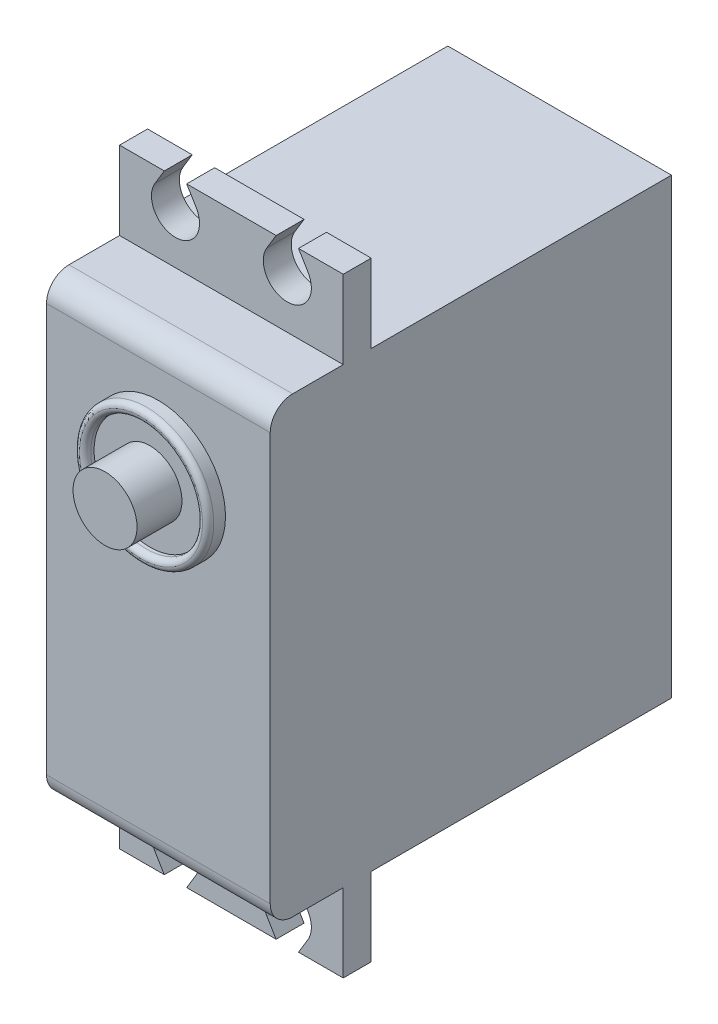
ISO-10303-21;
HEADER;
FILE_DESCRIPTION(('STEP AP214'),'2;1');
FILE_NAME('part.step','',(''),(''),'','','');
FILE_SCHEMA(('AUTOMOTIVE_DESIGN { 1 0 10303 214 1 1 1 1 }'));
ENDSEC;
DATA;
#1=APPLICATION_CONTEXT('core data for automotive mechanical design processes');
#2=APPLICATION_PROTOCOL_DEFINITION('international standard','automotive_design',2000,#1);
#3=PRODUCT_CONTEXT('',#1,'mechanical');
#4=PRODUCT('Part','Part','',(#3));
#5=PRODUCT_RELATED_PRODUCT_CATEGORY('part','',(#4));
#6=PRODUCT_DEFINITION_FORMATION('','',#4);
#7=PRODUCT_DEFINITION_CONTEXT('part definition',#1,'design');
#8=PRODUCT_DEFINITION('design','',#6,#7);
#9=PRODUCT_DEFINITION_SHAPE('','',#8);
#10=(LENGTH_UNIT() NAMED_UNIT(*) SI_UNIT(.MILLI.,.METRE.));
#11=(NAMED_UNIT(*) PLANE_ANGLE_UNIT() SI_UNIT($,.RADIAN.));
#12=(NAMED_UNIT(*) SI_UNIT($,.STERADIAN.) SOLID_ANGLE_UNIT());
#13=UNCERTAINTY_MEASURE_WITH_UNIT(LENGTH_MEASURE(1.E-05),#10,'distance_accuracy_value','');
#14=(GEOMETRIC_REPRESENTATION_CONTEXT(3) GLOBAL_UNCERTAINTY_ASSIGNED_CONTEXT((#13)) GLOBAL_UNIT_ASSIGNED_CONTEXT((#10,
#11,#12)) REPRESENTATION_CONTEXT('',''));
#15=CARTESIAN_POINT('',(0.,0.,0.));
#16=DIRECTION('',(0.,0.,1.));
#17=DIRECTION('',(1.,0.,0.));
#18=AXIS2_PLACEMENT_3D('',#15,#16,#17);
#19=CARTESIAN_POINT('',(10.,-27.25,-6.52999999999999));
#20=DIRECTION('',(0.,0.,-1.));
#21=DIRECTION('',(0.,1.,0.));
#22=AXIS2_PLACEMENT_3D('',#19,#20,#21);
#23=PLANE('',#22);
#24=DIRECTION('',(-0.517799102380035,-0.855502244049909,0.));
#25=VECTOR('',#24,1.);
#26=CARTESIAN_POINT('',(9.14362215465058,-5.53424538288419,-6.53000000000004));
#27=LINE('',#26,#25);
#28=CARTESIAN_POINT('',(-3.1606701752927,-25.8632680701171,-6.53000000000004));
#29=VERTEX_POINT('',#28);
#30=CARTESIAN_POINT('',(-4.,-27.25,-6.53000000000004));
#31=VERTEX_POINT('',#30);
#32=EDGE_CURVE('E242',#29,#31,#27,.T.);
#33=ORIENTED_EDGE('',*,*,#32,.T.);
#34=DIRECTION('',(-1.,0.,0.));
#35=VECTOR('',#34,1.);
#36=CARTESIAN_POINT('',(10.,-27.25,-6.52999999999999));
#37=LINE('',#36,#35);
#38=CARTESIAN_POINT('',(4.,-27.25,-6.53000000000004));
#39=VERTEX_POINT('',#38);
#40=EDGE_CURVE('E425',#39,#31,#37,.T.);
#41=ORIENTED_EDGE('',*,*,#40,.F.);
#42=DIRECTION('',(0.517799102380035,-0.855502244049909,0.));
#43=VECTOR('',#42,1.);
#44=CARTESIAN_POINT('',(-9.14362215465058,-5.53424538288419,-6.53000000000004));
#45=LINE('',#44,#43);
#46=CARTESIAN_POINT('',(3.1606701752927,-25.8632680701171,-6.53000000000004));
#47=VERTEX_POINT('',#46);
#48=EDGE_CURVE('E278',#47,#39,#45,.T.);
#49=ORIENTED_EDGE('',*,*,#48,.F.);
#50=CARTESIAN_POINT('',(5.,-24.75,-6.53000000000004));
#51=DIRECTION('',(0.,0.,-1.));
#52=DIRECTION('',(1.,0.,0.));
#53=AXIS2_PLACEMENT_3D('',#50,#51,#52);
#54=CIRCLE('',#53,2.15);
#55=CARTESIAN_POINT('',(6.83932982470731,-25.8632680701171,-6.53000000000004));
#56=VERTEX_POINT('',#55);
#57=EDGE_CURVE('E275',#56,#47,#54,.F.);
#58=ORIENTED_EDGE('',*,*,#57,.F.);
#59=DIRECTION('',(-0.517799102380035,-0.855502244049909,0.));
#60=VECTOR('',#59,1.);
#61=CARTESIAN_POINT('',(16.4624630503949,-9.96402832341568,-6.53000000000004));
#62=LINE('',#61,#60);
#63=CARTESIAN_POINT('',(6.,-27.25,-6.53000000000004));
#64=VERTEX_POINT('',#63);
#65=EDGE_CURVE('E280',#56,#64,#62,.T.);
#66=ORIENTED_EDGE('',*,*,#65,.T.);
#67=CARTESIAN_POINT('',(10.,-27.25,-6.52999999999999));
#68=VERTEX_POINT('',#67);
#69=EDGE_CURVE('E421',#68,#64,#37,.T.);
#70=ORIENTED_EDGE('',*,*,#69,.F.);
#71=DIRECTION('',(0.,-1.,0.));
#72=VECTOR('',#71,1.);
#73=CARTESIAN_POINT('',(10.,-27.25,-6.52999999999999));
#74=LINE('',#73,#72);
#75=CARTESIAN_POINT('',(10.,-20.25,-6.53000000000001));
#76=VERTEX_POINT('',#75);
#77=EDGE_CURVE('E367',#76,#68,#74,.T.);
#78=ORIENTED_EDGE('',*,*,#77,.F.);
#79=DIRECTION('',(-1.,0.,0.));
#80=VECTOR('',#79,1.);
#81=CARTESIAN_POINT('',(10.,-20.25,-6.53000000000001));
#82=LINE('',#81,#80);
#83=CARTESIAN_POINT('',(-10.,-20.25,-6.53000000000001));
#84=VERTEX_POINT('',#83);
#85=EDGE_CURVE('E424',#76,#84,#82,.T.);
#86=ORIENTED_EDGE('',*,*,#85,.T.);
#87=DIRECTION('',(0.,-1.,0.));
#88=VECTOR('',#87,1.);
#89=CARTESIAN_POINT('',(-10.,-27.25,-6.52999999999999));
#90=LINE('',#89,#88);
#91=CARTESIAN_POINT('',(-10.,-27.25,-6.52999999999999));
#92=VERTEX_POINT('',#91);
#93=EDGE_CURVE('E398',#84,#92,#90,.T.);
#94=ORIENTED_EDGE('',*,*,#93,.T.);
#95=CARTESIAN_POINT('',(-6.,-27.25,-6.53000000000004));
#96=VERTEX_POINT('',#95);
#97=EDGE_CURVE('E256',#96,#92,#37,.T.);
#98=ORIENTED_EDGE('',*,*,#97,.F.);
#99=DIRECTION('',(0.517799102380035,-0.855502244049909,0.));
#100=VECTOR('',#99,1.);
#101=CARTESIAN_POINT('',(-16.4624630503949,-9.96402832341568,-6.53000000000004));
#102=LINE('',#101,#100);
#103=CARTESIAN_POINT('',(-6.83932982470731,-25.8632680701171,-6.53000000000004));
#104=VERTEX_POINT('',#103);
#105=EDGE_CURVE('E238',#104,#96,#102,.T.);
#106=ORIENTED_EDGE('',*,*,#105,.F.);
#107=CARTESIAN_POINT('',(-5.,-24.75,-6.53000000000004));
#108=DIRECTION('',(0.,0.,-1.));
#109=DIRECTION('',(1.,0.,0.));
#110=AXIS2_PLACEMENT_3D('',#107,#108,#109);
#111=CIRCLE('',#110,2.15);
#112=EDGE_CURVE('E245',#104,#29,#111,.T.);
#113=ORIENTED_EDGE('',*,*,#112,.T.);
#114=EDGE_LOOP('',(#33,#41,#49,#58,#66,#70,#78,#86,#94,#98,#106,#113));
#115=FACE_BOUND('',#114,.T.);
#116=ADVANCED_FACE('F38',(#115),#23,.F.);
#117=CARTESIAN_POINT('',(10.,-27.25,-9.02999999999999));
#118=DIRECTION('',(0.,1.,0.));
#119=DIRECTION('',(0.,0.,1.));
#120=AXIS2_PLACEMENT_3D('',#117,#118,#119);
#121=PLANE('',#120);
#122=DIRECTION('',(0.,0.,1.));
#123=VECTOR('',#122,1.);
#124=CARTESIAN_POINT('',(-4.,-27.25,-15.363442981507));
#125=LINE('',#124,#123);
#126=CARTESIAN_POINT('',(-4.,-27.25,-9.02999999999999));
#127=VERTEX_POINT('',#126);
#128=EDGE_CURVE('E263',#127,#31,#125,.T.);
#129=ORIENTED_EDGE('',*,*,#128,.F.);
#130=DIRECTION('',(-1.,0.,0.));
#131=VECTOR('',#130,1.);
#132=CARTESIAN_POINT('',(10.,-27.25,-9.02999999999999));
#133=LINE('',#132,#131);
#134=CARTESIAN_POINT('',(3.99999999999999,-27.25,-9.02999999999999));
#135=VERTEX_POINT('',#134);
#136=EDGE_CURVE('E420',#135,#127,#133,.T.);
#137=ORIENTED_EDGE('',*,*,#136,.F.);
#138=DIRECTION('',(0.,0.,1.));
#139=VECTOR('',#138,1.);
#140=CARTESIAN_POINT('',(4.,-27.25,-15.363442981507));
#141=LINE('',#140,#139);
#142=EDGE_CURVE('E62',#135,#39,#141,.T.);
#143=ORIENTED_EDGE('',*,*,#142,.T.);
#144=ORIENTED_EDGE('',*,*,#40,.T.);
#145=EDGE_LOOP('',(#129,#137,#143,#144));
#146=FACE_BOUND('',#145,.T.);
#147=ADVANCED_FACE('F477',(#146),#121,.F.);
#148=DIRECTION('',(0.,0.,1.));
#149=VECTOR('',#148,1.);
#150=CARTESIAN_POINT('',(6.,-27.25,-15.363442981507));
#151=LINE('',#150,#149);
#152=CARTESIAN_POINT('',(6.,-27.25,-9.02999999999999));
#153=VERTEX_POINT('',#152);
#154=EDGE_CURVE('E285',#153,#64,#151,.T.);
#155=ORIENTED_EDGE('',*,*,#154,.F.);
#156=CARTESIAN_POINT('',(10.,-27.25,-9.02999999999999));
#157=VERTEX_POINT('',#156);
#158=EDGE_CURVE('E417',#157,#153,#133,.T.);
#159=ORIENTED_EDGE('',*,*,#158,.F.);
#160=DIRECTION('',(0.,0.,-1.));
#161=VECTOR('',#160,1.);
#162=CARTESIAN_POINT('',(10.,-27.25,-9.02999999999999));
#163=LINE('',#162,#161);
#164=EDGE_CURVE('E369',#68,#157,#163,.T.);
#165=ORIENTED_EDGE('',*,*,#164,.F.);
#166=ORIENTED_EDGE('',*,*,#69,.T.);
#167=EDGE_LOOP('',(#155,#159,#165,#166));
#168=FACE_BOUND('',#167,.T.);
#169=ADVANCED_FACE('F482',(#168),#121,.F.);
#170=CARTESIAN_POINT('',(10.,-20.25,-9.02999999999999));
#171=DIRECTION('',(0.,0.,1.));
#172=DIRECTION('',(0.,-1.,0.));
#173=AXIS2_PLACEMENT_3D('',#170,#171,#172);
#174=PLANE('',#173);
#175=DIRECTION('',(0.517799102380035,0.855502244049909,0.));
#176=VECTOR('',#175,1.);
#177=CARTESIAN_POINT('',(9.14362215465058,-5.53424538288419,-9.02999999999999));
#178=LINE('',#177,#176);
#179=CARTESIAN_POINT('',(-3.1606701752927,-25.8632680701171,-9.02999999999999));
#180=VERTEX_POINT('',#179);
#181=EDGE_CURVE('E262',#127,#180,#178,.T.);
#182=ORIENTED_EDGE('',*,*,#181,.T.);
#183=CARTESIAN_POINT('',(-5.,-24.75,-9.02999999999999));
#184=DIRECTION('',(0.,0.,1.));
#185=DIRECTION('',(1.,0.,0.));
#186=AXIS2_PLACEMENT_3D('',#183,#184,#185);
#187=CIRCLE('',#186,2.15);
#188=CARTESIAN_POINT('',(-6.83932982470731,-25.8632680701171,-9.02999999999999));
#189=VERTEX_POINT('',#188);
#190=EDGE_CURVE('E268',#180,#189,#187,.T.);
#191=ORIENTED_EDGE('',*,*,#190,.T.);
#192=DIRECTION('',(-0.517799102380035,0.855502244049909,0.));
#193=VECTOR('',#192,1.);
#194=CARTESIAN_POINT('',(-16.4624630503949,-9.96402832341568,-9.02999999999999));
#195=LINE('',#194,#193);
#196=CARTESIAN_POINT('',(-6.,-27.25,-9.02999999999999));
#197=VERTEX_POINT('',#196);
#198=EDGE_CURVE('E239',#197,#189,#195,.T.);
#199=ORIENTED_EDGE('',*,*,#198,.F.);
#200=CARTESIAN_POINT('',(-10.,-27.25,-9.02999999999999));
#201=VERTEX_POINT('',#200);
#202=EDGE_CURVE('E416',#197,#201,#133,.T.);
#203=ORIENTED_EDGE('',*,*,#202,.T.);
#204=DIRECTION('',(0.,1.,0.));
#205=VECTOR('',#204,1.);
#206=CARTESIAN_POINT('',(-10.,-20.25,-9.02999999999999));
#207=LINE('',#206,#205);
#208=CARTESIAN_POINT('',(-10.,-20.25,-9.02999999999999));
#209=VERTEX_POINT('',#208);
#210=EDGE_CURVE('E403',#201,#209,#207,.T.);
#211=ORIENTED_EDGE('',*,*,#210,.T.);
#212=DIRECTION('',(-1.,0.,0.));
#213=VECTOR('',#212,1.);
#214=CARTESIAN_POINT('',(10.,-20.25,-9.02999999999999));
#215=LINE('',#214,#213);
#216=CARTESIAN_POINT('',(10.,-20.25,-9.02999999999999));
#217=VERTEX_POINT('',#216);
#218=EDGE_CURVE('E413',#217,#209,#215,.T.);
#219=ORIENTED_EDGE('',*,*,#218,.F.);
#220=DIRECTION('',(0.,1.,0.));
#221=VECTOR('',#220,1.);
#222=CARTESIAN_POINT('',(10.,-20.25,-9.02999999999999));
#223=LINE('',#222,#221);
#224=EDGE_CURVE('E371',#157,#217,#223,.T.);
#225=ORIENTED_EDGE('',*,*,#224,.F.);
#226=ORIENTED_EDGE('',*,*,#158,.T.);
#227=DIRECTION('',(0.517799102380035,0.855502244049909,0.));
#228=VECTOR('',#227,1.);
#229=CARTESIAN_POINT('',(16.4624630503949,-9.96402832341568,-9.02999999999999));
#230=LINE('',#229,#228);
#231=CARTESIAN_POINT('',(6.83932982470731,-25.8632680701171,-9.02999999999999));
#232=VERTEX_POINT('',#231);
#233=EDGE_CURVE('E269',#153,#232,#230,.T.);
#234=ORIENTED_EDGE('',*,*,#233,.T.);
#235=CARTESIAN_POINT('',(5.,-24.75,-9.02999999999999));
#236=DIRECTION('',(0.,0.,1.));
#237=DIRECTION('',(1.,0.,0.));
#238=AXIS2_PLACEMENT_3D('',#235,#236,#237);
#239=CIRCLE('',#238,2.15);
#240=CARTESIAN_POINT('',(3.1606701752927,-25.8632680701171,-9.02999999999999));
#241=VERTEX_POINT('',#240);
#242=EDGE_CURVE('E272',#241,#232,#239,.F.);
#243=ORIENTED_EDGE('',*,*,#242,.F.);
#244=DIRECTION('',(-0.517799102380035,0.855502244049909,0.));
#245=VECTOR('',#244,1.);
#246=CARTESIAN_POINT('',(-9.14362215465058,-5.53424538288419,-9.02999999999999));
#247=LINE('',#246,#245);
#248=EDGE_CURVE('E252',#135,#241,#247,.T.);
#249=ORIENTED_EDGE('',*,*,#248,.F.);
#250=ORIENTED_EDGE('',*,*,#136,.T.);
#251=EDGE_LOOP('',(#182,#191,#199,#203,#211,#219,#225,#226,#234,#243,#249,#250));
#252=FACE_BOUND('',#251,.T.);
#253=ADVANCED_FACE('F521',(#252),#174,.F.);
#254=CARTESIAN_POINT('',(10.,20.25,-9.02999999999999));
#255=DIRECTION('',(0.,0.,1.));
#256=DIRECTION('',(1.,0.,0.));
#257=AXIS2_PLACEMENT_3D('',#254,#255,#256);
#258=PLANE('',#257);
#259=DIRECTION('',(-0.517799102380035,-0.855502244049909,0.));
#260=VECTOR('',#259,1.);
#261=CARTESIAN_POINT('',(-16.4624630503949,9.96402832341568,-9.02999999999999));
#262=LINE('',#261,#260);
#263=CARTESIAN_POINT('',(-6.,27.25,-9.02999999999999));
#264=VERTEX_POINT('',#263);
#265=CARTESIAN_POINT('',(-6.83932982470731,25.8632680701171,-9.02999999999999));
#266=VERTEX_POINT('',#265);
#267=EDGE_CURVE('E297',#264,#266,#262,.T.);
#268=ORIENTED_EDGE('',*,*,#267,.T.);
#269=CARTESIAN_POINT('',(-5.,24.75,-9.02999999999999));
#270=DIRECTION('',(0.,0.,1.));
#271=DIRECTION('',(1.,0.,0.));
#272=AXIS2_PLACEMENT_3D('',#269,#270,#271);
#273=CIRCLE('',#272,2.15);
#274=CARTESIAN_POINT('',(-3.1606701752927,25.8632680701171,-9.02999999999999));
#275=VERTEX_POINT('',#274);
#276=EDGE_CURVE('E300',#275,#266,#273,.F.);
#277=ORIENTED_EDGE('',*,*,#276,.F.);
#278=DIRECTION('',(0.517799102380035,-0.855502244049909,0.));
#279=VECTOR('',#278,1.);
#280=CARTESIAN_POINT('',(9.14362215465058,5.53424538288419,-9.02999999999999));
#281=LINE('',#280,#279);
#282=CARTESIAN_POINT('',(-4.,27.25,-9.02999999999999));
#283=VERTEX_POINT('',#282);
#284=EDGE_CURVE('E303',#283,#275,#281,.T.);
#285=ORIENTED_EDGE('',*,*,#284,.F.);
#286=DIRECTION('',(-1.,0.,0.));
#287=VECTOR('',#286,1.);
#288=CARTESIAN_POINT('',(10.,27.25,-9.02999999999999));
#289=LINE('',#288,#287);
#290=CARTESIAN_POINT('',(4.,27.25,-9.02999999999999));
#291=VERTEX_POINT('',#290);
#292=EDGE_CURVE('E453',#291,#283,#289,.T.);
#293=ORIENTED_EDGE('',*,*,#292,.F.);
#294=DIRECTION('',(-0.517799102380035,-0.855502244049909,0.));
#295=VECTOR('',#294,1.);
#296=CARTESIAN_POINT('',(-9.14362215465058,5.53424538288419,-9.02999999999999));
#297=LINE('',#296,#295);
#298=CARTESIAN_POINT('',(3.1606701752927,25.8632680701171,-9.02999999999999));
#299=VERTEX_POINT('',#298);
#300=EDGE_CURVE('E323',#291,#299,#297,.T.);
#301=ORIENTED_EDGE('',*,*,#300,.T.);
#302=CARTESIAN_POINT('',(5.,24.75,-9.02999999999999));
#303=DIRECTION('',(0.,0.,1.));
#304=DIRECTION('',(1.,0.,0.));
#305=AXIS2_PLACEMENT_3D('',#302,#303,#304);
#306=CIRCLE('',#305,2.15);
#307=CARTESIAN_POINT('',(6.83932982470731,25.8632680701171,-9.02999999999999));
#308=VERTEX_POINT('',#307);
#309=EDGE_CURVE('E326',#299,#308,#306,.T.);
#310=ORIENTED_EDGE('',*,*,#309,.T.);
#311=DIRECTION('',(0.517799102380035,-0.855502244049909,0.));
#312=VECTOR('',#311,1.);
#313=CARTESIAN_POINT('',(16.4624630503949,9.96402832341568,-9.02999999999999));
#314=LINE('',#313,#312);
#315=CARTESIAN_POINT('',(6.,27.25,-9.02999999999999));
#316=VERTEX_POINT('',#315);
#317=EDGE_CURVE('E307',#316,#308,#314,.T.);
#318=ORIENTED_EDGE('',*,*,#317,.F.);
#319=CARTESIAN_POINT('',(10.,27.25,-9.02999999999999));
#320=VERTEX_POINT('',#319);
#321=EDGE_CURVE('E449',#320,#316,#289,.T.);
#322=ORIENTED_EDGE('',*,*,#321,.F.);
#323=DIRECTION('',(0.,1.,0.));
#324=VECTOR('',#323,1.);
#325=CARTESIAN_POINT('',(10.,20.25,-9.02999999999999));
#326=LINE('',#325,#324);
#327=CARTESIAN_POINT('',(10.,20.25,-9.02999999999999));
#328=VERTEX_POINT('',#327);
#329=EDGE_CURVE('E350',#328,#320,#326,.T.);
#330=ORIENTED_EDGE('',*,*,#329,.F.);
#331=DIRECTION('',(-1.,0.,0.));
#332=VECTOR('',#331,1.);
#333=CARTESIAN_POINT('',(10.,20.25,-9.02999999999999));
#334=LINE('',#333,#332);
#335=CARTESIAN_POINT('',(-10.,20.25,-9.02999999999999));
#336=VERTEX_POINT('',#335);
#337=EDGE_CURVE('E452',#328,#336,#334,.T.);
#338=ORIENTED_EDGE('',*,*,#337,.T.);
#339=DIRECTION('',(0.,1.,0.));
#340=VECTOR('',#339,1.);
#341=CARTESIAN_POINT('',(-10.,20.25,-9.02999999999999));
#342=LINE('',#341,#340);
#343=CARTESIAN_POINT('',(-10.,27.25,-9.02999999999999));
#344=VERTEX_POINT('',#343);
#345=EDGE_CURVE('E380',#336,#344,#342,.T.);
#346=ORIENTED_EDGE('',*,*,#345,.T.);
#347=EDGE_CURVE('E447',#264,#344,#289,.T.);
#348=ORIENTED_EDGE('',*,*,#347,.F.);
#349=EDGE_LOOP('',(#268,#277,#285,#293,#301,#310,#318,#322,#330,#338,#346,#348));
#350=FACE_BOUND('',#349,.T.);
#351=ADVANCED_FACE('F519',(#350),#258,.F.);
#352=CARTESIAN_POINT('',(10.,27.25,-9.02999999999999));
#353=DIRECTION('',(0.,-1.,0.));
#354=DIRECTION('',(0.,0.,-1.));
#355=AXIS2_PLACEMENT_3D('',#352,#353,#354);
#356=PLANE('',#355);
#357=DIRECTION('',(0.,0.,1.));
#358=VECTOR('',#357,1.);
#359=CARTESIAN_POINT('',(-6.,27.25,-15.363442981507));
#360=LINE('',#359,#358);
#361=CARTESIAN_POINT('',(-6.,27.25,-6.53000000000004));
#362=VERTEX_POINT('',#361);
#363=EDGE_CURVE('E314',#264,#362,#360,.T.);
#364=ORIENTED_EDGE('',*,*,#363,.F.);
#365=ORIENTED_EDGE('',*,*,#347,.T.);
#366=DIRECTION('',(0.,0.,1.));
#367=VECTOR('',#366,1.);
#368=CARTESIAN_POINT('',(-10.,27.25,-9.02999999999999));
#369=LINE('',#368,#367);
#370=CARTESIAN_POINT('',(-10.,27.25,-6.52999999999999));
#371=VERTEX_POINT('',#370);
#372=EDGE_CURVE('E383',#344,#371,#369,.T.);
#373=ORIENTED_EDGE('',*,*,#372,.T.);
#374=DIRECTION('',(-1.,0.,0.));
#375=VECTOR('',#374,1.);
#376=CARTESIAN_POINT('',(10.,27.25,-6.52999999999999));
#377=LINE('',#376,#375);
#378=EDGE_CURVE('E443',#362,#371,#377,.T.);
#379=ORIENTED_EDGE('',*,*,#378,.F.);
#380=EDGE_LOOP('',(#364,#365,#373,#379));
#381=FACE_BOUND('',#380,.T.);
#382=ADVANCED_FACE('F518',(#381),#356,.F.);
#383=ORIENTED_EDGE('',*,*,#292,.T.);
#384=DIRECTION('',(0.,0.,1.));
#385=VECTOR('',#384,1.);
#386=CARTESIAN_POINT('',(-4.,27.25,-15.363442981507));
#387=LINE('',#386,#385);
#388=CARTESIAN_POINT('',(-4.,27.25,-6.53000000000004));
#389=VERTEX_POINT('',#388);
#390=EDGE_CURVE('E316',#283,#389,#387,.T.);
#391=ORIENTED_EDGE('',*,*,#390,.T.);
#392=CARTESIAN_POINT('',(4.,27.25,-6.53000000000004));
#393=VERTEX_POINT('',#392);
#394=EDGE_CURVE('E448',#393,#389,#377,.T.);
#395=ORIENTED_EDGE('',*,*,#394,.F.);
#396=DIRECTION('',(0.,0.,1.));
#397=VECTOR('',#396,1.);
#398=CARTESIAN_POINT('',(4.,27.25,-15.363442981507));
#399=LINE('',#398,#397);
#400=EDGE_CURVE('E339',#291,#393,#399,.T.);
#401=ORIENTED_EDGE('',*,*,#400,.F.);
#402=EDGE_LOOP('',(#383,#391,#395,#401));
#403=FACE_BOUND('',#402,.T.);
#404=ADVANCED_FACE('F513',(#403),#356,.F.);
#405=CARTESIAN_POINT('',(10.,27.25,-6.52999999999999));
#406=DIRECTION('',(0.,0.,-1.));
#407=DIRECTION('',(0.,1.,0.));
#408=AXIS2_PLACEMENT_3D('',#405,#406,#407);
#409=PLANE('',#408);
#410=DIRECTION('',(0.517799102380035,0.855502244049909,0.));
#411=VECTOR('',#410,1.);
#412=CARTESIAN_POINT('',(-16.4624630503949,9.96402832341568,-6.53000000000004));
#413=LINE('',#412,#411);
#414=CARTESIAN_POINT('',(-6.83932982470731,25.8632680701171,-6.53000000000004));
#415=VERTEX_POINT('',#414);
#416=EDGE_CURVE('E309',#415,#362,#413,.T.);
#417=ORIENTED_EDGE('',*,*,#416,.T.);
#418=ORIENTED_EDGE('',*,*,#378,.T.);
#419=DIRECTION('',(0.,-1.,0.));
#420=VECTOR('',#419,1.);
#421=CARTESIAN_POINT('',(-10.,27.25,-6.52999999999999));
#422=LINE('',#421,#420);
#423=CARTESIAN_POINT('',(-10.,20.25,-6.53));
#424=VERTEX_POINT('',#423);
#425=EDGE_CURVE('E386',#371,#424,#422,.T.);
#426=ORIENTED_EDGE('',*,*,#425,.T.);
#427=DIRECTION('',(-1.,0.,0.));
#428=VECTOR('',#427,1.);
#429=CARTESIAN_POINT('',(10.,20.25,-6.53));
#430=LINE('',#429,#428);
#431=CARTESIAN_POINT('',(10.,20.25,-6.53));
#432=VERTEX_POINT('',#431);
#433=EDGE_CURVE('E440',#432,#424,#430,.T.);
#434=ORIENTED_EDGE('',*,*,#433,.F.);
#435=DIRECTION('',(0.,-1.,0.));
#436=VECTOR('',#435,1.);
#437=CARTESIAN_POINT('',(10.,27.25,-6.52999999999999));
#438=LINE('',#437,#436);
#439=CARTESIAN_POINT('',(10.,27.25,-6.52999999999999));
#440=VERTEX_POINT('',#439);
#441=EDGE_CURVE('E355',#440,#432,#438,.T.);
#442=ORIENTED_EDGE('',*,*,#441,.F.);
#443=CARTESIAN_POINT('',(6.,27.25,-6.53000000000004));
#444=VERTEX_POINT('',#443);
#445=EDGE_CURVE('E444',#440,#444,#377,.T.);
#446=ORIENTED_EDGE('',*,*,#445,.T.);
#447=DIRECTION('',(-0.517799102380035,0.855502244049909,0.));
#448=VECTOR('',#447,1.);
#449=CARTESIAN_POINT('',(16.4624630503949,9.96402832341568,-6.53000000000004));
#450=LINE('',#449,#448);
#451=CARTESIAN_POINT('',(6.83932982470731,25.8632680701171,-6.52999999999999));
#452=VERTEX_POINT('',#451);
#453=EDGE_CURVE('E332',#452,#444,#450,.T.);
#454=ORIENTED_EDGE('',*,*,#453,.F.);
#455=CARTESIAN_POINT('',(5.,24.75,-6.53000000000004));
#456=DIRECTION('',(0.,0.,1.));
#457=DIRECTION('',(1.,0.,0.));
#458=AXIS2_PLACEMENT_3D('',#455,#456,#457);
#459=CIRCLE('',#458,2.15);
#460=CARTESIAN_POINT('',(3.1606701752927,25.8632680701171,-6.53000000000004));
#461=VERTEX_POINT('',#460);
#462=EDGE_CURVE('E296',#452,#461,#459,.F.);
#463=ORIENTED_EDGE('',*,*,#462,.T.);
#464=DIRECTION('',(0.517799102380035,0.855502244049909,0.));
#465=VECTOR('',#464,1.);
#466=CARTESIAN_POINT('',(-9.14362215465058,5.53424538288419,-6.53000000000004));
#467=LINE('',#466,#465);
#468=EDGE_CURVE('E334',#461,#393,#467,.T.);
#469=ORIENTED_EDGE('',*,*,#468,.T.);
#470=ORIENTED_EDGE('',*,*,#394,.T.);
#471=DIRECTION('',(-0.517799102380035,0.855502244049909,0.));
#472=VECTOR('',#471,1.);
#473=CARTESIAN_POINT('',(9.14362215465058,5.53424538288419,-6.53000000000004));
#474=LINE('',#473,#472);
#475=CARTESIAN_POINT('',(-3.16067017529269,25.8632680701171,-6.52999999999999));
#476=VERTEX_POINT('',#475);
#477=EDGE_CURVE('E306',#476,#389,#474,.T.);
#478=ORIENTED_EDGE('',*,*,#477,.F.);
#479=CARTESIAN_POINT('',(-5.,24.75,-6.53000000000004));
#480=DIRECTION('',(0.,0.,1.));
#481=DIRECTION('',(1.,0.,0.));
#482=AXIS2_PLACEMENT_3D('',#479,#480,#481);
#483=CIRCLE('',#482,2.15);
#484=EDGE_CURVE('E304',#415,#476,#483,.T.);
#485=ORIENTED_EDGE('',*,*,#484,.F.);
#486=EDGE_LOOP('',(#417,#418,#426,#434,#442,#446,#454,#463,#469,#470,#478,#485));
#487=FACE_BOUND('',#486,.T.);
#488=ADVANCED_FACE('F509',(#487),#409,.F.);
#489=CARTESIAN_POINT('',(10.,20.25,-35.88));
#490=DIRECTION('',(0.,-1.,0.));
#491=DIRECTION('',(0.,0.,-1.));
#492=AXIS2_PLACEMENT_3D('',#489,#490,#491);
#493=PLANE('',#492);
#494=DIRECTION('',(0.,0.,1.));
#495=VECTOR('',#494,1.);
#496=CARTESIAN_POINT('',(-10.,20.25,-35.88));
#497=LINE('',#496,#495);
#498=CARTESIAN_POINT('',(-10.,20.25,-35.88));
#499=VERTEX_POINT('',#498);
#500=EDGE_CURVE('E322',#499,#336,#497,.T.);
#501=ORIENTED_EDGE('',*,*,#500,.T.);
#502=ORIENTED_EDGE('',*,*,#337,.F.);
#503=DIRECTION('',(0.,0.,1.));
#504=VECTOR('',#503,1.);
#505=CARTESIAN_POINT('',(10.,20.25,-35.88));
#506=LINE('',#505,#504);
#507=CARTESIAN_POINT('',(10.,20.25,-35.88));
#508=VERTEX_POINT('',#507);
#509=EDGE_CURVE('E347',#508,#328,#506,.T.);
#510=ORIENTED_EDGE('',*,*,#509,.F.);
#511=DIRECTION('',(-1.,0.,0.));
#512=VECTOR('',#511,1.);
#513=CARTESIAN_POINT('',(10.,20.25,-35.88));
#514=LINE('',#513,#512);
#515=EDGE_CURVE('E377',#508,#499,#514,.T.);
#516=ORIENTED_EDGE('',*,*,#515,.T.);
#517=EDGE_LOOP('',(#501,#502,#510,#516));
#518=FACE_BOUND('',#517,.T.);
#519=ADVANCED_FACE('F512',(#518),#493,.F.);
#520=ORIENTED_EDGE('',*,*,#321,.T.);
#521=DIRECTION('',(0.,0.,1.));
#522=VECTOR('',#521,1.);
#523=CARTESIAN_POINT('',(6.,27.25,-15.363442981507));
#524=LINE('',#523,#522);
#525=EDGE_CURVE('E341',#316,#444,#524,.T.);
#526=ORIENTED_EDGE('',*,*,#525,.T.);
#527=ORIENTED_EDGE('',*,*,#445,.F.);
#528=DIRECTION('',(0.,0.,1.));
#529=VECTOR('',#528,1.);
#530=CARTESIAN_POINT('',(10.,27.25,-9.02999999999999));
#531=LINE('',#530,#529);
#532=EDGE_CURVE('E353',#320,#440,#531,.T.);
#533=ORIENTED_EDGE('',*,*,#532,.F.);
#534=EDGE_LOOP('',(#520,#526,#527,#533));
#535=FACE_BOUND('',#534,.T.);
#536=ADVANCED_FACE('F507',(#535),#356,.F.);
#537=CARTESIAN_POINT('',(10.,20.25,-6.53));
#538=DIRECTION('',(0.,-1.,0.));
#539=DIRECTION('',(0.,0.,-1.));
#540=AXIS2_PLACEMENT_3D('',#537,#538,#539);
#541=PLANE('',#540);
#542=DIRECTION('',(0.,0.,1.));
#543=VECTOR('',#542,1.);
#544=CARTESIAN_POINT('',(-10.,20.25,-6.53));
#545=LINE('',#544,#543);
#546=CARTESIAN_POINT('',(-10.,20.25,-2.));
#547=VERTEX_POINT('',#546);
#548=EDGE_CURVE('E388',#424,#547,#545,.T.);
#549=ORIENTED_EDGE('',*,*,#548,.T.);
#550=DIRECTION('',(-1.,0.,0.));
#551=VECTOR('',#550,1.);
#552=CARTESIAN_POINT('',(10.,20.25,-2.));
#553=LINE('',#552,#551);
#554=CARTESIAN_POINT('',(10.,20.25,-2.));
#555=VERTEX_POINT('',#554);
#556=EDGE_CURVE('E437',#555,#547,#553,.T.);
#557=ORIENTED_EDGE('',*,*,#556,.F.);
#558=DIRECTION('',(0.,0.,1.));
#559=VECTOR('',#558,1.);
#560=CARTESIAN_POINT('',(10.,20.25,-6.53));
#561=LINE('',#560,#559);
#562=EDGE_CURVE('E357',#432,#555,#561,.T.);
#563=ORIENTED_EDGE('',*,*,#562,.F.);
#564=ORIENTED_EDGE('',*,*,#433,.T.);
#565=EDGE_LOOP('',(#549,#557,#563,#564));
#566=FACE_BOUND('',#565,.T.);
#567=ADVANCED_FACE('F503',(#566),#541,.F.);
#568=CARTESIAN_POINT('',(10.,18.25,-2.));
#569=DIRECTION('',(-1.,0.,0.));
#570=DIRECTION('',(0.,0.,1.));
#571=AXIS2_PLACEMENT_3D('',#568,#569,#570);
#572=CYLINDRICAL_SURFACE('',#571,2.);
#573=CARTESIAN_POINT('',(-10.,18.25,-2.));
#574=DIRECTION('',(1.,0.,0.));
#575=DIRECTION('',(0.,0.,-1.));
#576=AXIS2_PLACEMENT_3D('',#573,#574,#575);
#577=CIRCLE('',#576,2.);
#578=CARTESIAN_POINT('',(-10.,18.25,0.));
#579=VERTEX_POINT('',#578);
#580=EDGE_CURVE('E390',#547,#579,#577,.T.);
#581=ORIENTED_EDGE('',*,*,#580,.T.);
#582=DIRECTION('',(-1.,0.,0.));
#583=VECTOR('',#582,1.);
#584=CARTESIAN_POINT('',(10.,18.25,0.));
#585=LINE('',#584,#583);
#586=CARTESIAN_POINT('',(10.,18.25,0.));
#587=VERTEX_POINT('',#586);
#588=EDGE_CURVE('E434',#587,#579,#585,.T.);
#589=ORIENTED_EDGE('',*,*,#588,.F.);
#590=CARTESIAN_POINT('',(10.,18.25,-2.));
#591=DIRECTION('',(1.,0.,0.));
#592=DIRECTION('',(0.,0.,-1.));
#593=AXIS2_PLACEMENT_3D('',#590,#591,#592);
#594=CIRCLE('',#593,2.);
#595=EDGE_CURVE('E359',#555,#587,#594,.T.);
#596=ORIENTED_EDGE('',*,*,#595,.F.);
#597=ORIENTED_EDGE('',*,*,#556,.T.);
#598=EDGE_LOOP('',(#581,#589,#596,#597));
#599=FACE_BOUND('',#598,.T.);
#600=ADVANCED_FACE('F499',(#599),#572,.T.);
#601=CARTESIAN_POINT('',(10.,18.25,0.));
#602=DIRECTION('',(0.,0.,-1.));
#603=DIRECTION('',(0.,1.,0.));
#604=AXIS2_PLACEMENT_3D('',#601,#602,#603);
#605=PLANE('',#604);
#606=CARTESIAN_POINT('',(0.,9.75,0.));
#607=DIRECTION('',(0.,0.,-1.));
#608=DIRECTION('',(0.,1.,0.));
#609=AXIS2_PLACEMENT_3D('',#606,#607,#608);
#610=CIRCLE('',#609,6.);
#611=CARTESIAN_POINT('',(0.,15.75,0.));
#612=VERTEX_POINT('',#611);
#613=EDGE_CURVE('E456',#612,#612,#610,.F.);
#614=ORIENTED_EDGE('',*,*,#613,.F.);
#615=EDGE_LOOP('',(#614));
#616=FACE_BOUND('',#615,.T.);
#617=DIRECTION('',(0.,-1.,0.));
#618=VECTOR('',#617,1.);
#619=CARTESIAN_POINT('',(-10.,18.25,0.));
#620=LINE('',#619,#618);
#621=CARTESIAN_POINT('',(-10.,-18.25,0.));
#622=VERTEX_POINT('',#621);
#623=EDGE_CURVE('E392',#579,#622,#620,.T.);
#624=ORIENTED_EDGE('',*,*,#623,.T.);
#625=DIRECTION('',(-1.,0.,0.));
#626=VECTOR('',#625,1.);
#627=CARTESIAN_POINT('',(10.,-18.25,0.));
#628=LINE('',#627,#626);
#629=CARTESIAN_POINT('',(10.,-18.25,0.));
#630=VERTEX_POINT('',#629);
#631=EDGE_CURVE('E431',#630,#622,#628,.T.);
#632=ORIENTED_EDGE('',*,*,#631,.F.);
#633=DIRECTION('',(0.,-1.,0.));
#634=VECTOR('',#633,1.);
#635=CARTESIAN_POINT('',(10.,18.25,0.));
#636=LINE('',#635,#634);
#637=EDGE_CURVE('E361',#587,#630,#636,.T.);
#638=ORIENTED_EDGE('',*,*,#637,.F.);
#639=ORIENTED_EDGE('',*,*,#588,.T.);
#640=EDGE_LOOP('',(#624,#632,#638,#639));
#641=FACE_BOUND('',#640,.T.);
#642=ADVANCED_FACE('F495',(#616,#641),#605,.F.);
#643=CARTESIAN_POINT('',(10.,-18.25,-2.));
#644=DIRECTION('',(-1.,0.,0.));
#645=DIRECTION('',(0.,0.,1.));
#646=AXIS2_PLACEMENT_3D('',#643,#644,#645);
#647=CYLINDRICAL_SURFACE('',#646,2.);
#648=CARTESIAN_POINT('',(-10.,-18.25,-2.));
#649=DIRECTION('',(1.,0.,0.));
#650=DIRECTION('',(0.,0.,1.));
#651=AXIS2_PLACEMENT_3D('',#648,#649,#650);
#652=CIRCLE('',#651,2.);
#653=CARTESIAN_POINT('',(-10.,-20.25,-2.));
#654=VERTEX_POINT('',#653);
#655=EDGE_CURVE('E394',#622,#654,#652,.T.);
#656=ORIENTED_EDGE('',*,*,#655,.T.);
#657=DIRECTION('',(-1.,0.,0.));
#658=VECTOR('',#657,1.);
#659=CARTESIAN_POINT('',(10.,-20.25,-2.));
#660=LINE('',#659,#658);
#661=CARTESIAN_POINT('',(10.,-20.25,-2.));
#662=VERTEX_POINT('',#661);
#663=EDGE_CURVE('E428',#662,#654,#660,.T.);
#664=ORIENTED_EDGE('',*,*,#663,.F.);
#665=CARTESIAN_POINT('',(10.,-18.25,-2.));
#666=DIRECTION('',(1.,0.,0.));
#667=DIRECTION('',(0.,0.,1.));
#668=AXIS2_PLACEMENT_3D('',#665,#666,#667);
#669=CIRCLE('',#668,2.);
#670=EDGE_CURVE('E363',#630,#662,#669,.T.);
#671=ORIENTED_EDGE('',*,*,#670,.F.);
#672=ORIENTED_EDGE('',*,*,#631,.T.);
#673=EDGE_LOOP('',(#656,#664,#671,#672));
#674=FACE_BOUND('',#673,.T.);
#675=ADVANCED_FACE('F491',(#674),#647,.T.);
#676=CARTESIAN_POINT('',(10.,-20.25,-6.53000000000001));
#677=DIRECTION('',(0.,1.,0.));
#678=DIRECTION('',(0.,0.,1.));
#679=AXIS2_PLACEMENT_3D('',#676,#677,#678);
#680=PLANE('',#679);
#681=DIRECTION('',(0.,0.,-1.));
#682=VECTOR('',#681,1.);
#683=CARTESIAN_POINT('',(-10.,-20.25,-6.53000000000001));
#684=LINE('',#683,#682);
#685=EDGE_CURVE('E396',#654,#84,#684,.T.);
#686=ORIENTED_EDGE('',*,*,#685,.T.);
#687=ORIENTED_EDGE('',*,*,#85,.F.);
#688=DIRECTION('',(0.,0.,-1.));
#689=VECTOR('',#688,1.);
#690=CARTESIAN_POINT('',(10.,-20.25,-6.53000000000001));
#691=LINE('',#690,#689);
#692=EDGE_CURVE('E365',#662,#76,#691,.T.);
#693=ORIENTED_EDGE('',*,*,#692,.F.);
#694=ORIENTED_EDGE('',*,*,#663,.T.);
#695=EDGE_LOOP('',(#686,#687,#693,#694));
#696=FACE_BOUND('',#695,.T.);
#697=ADVANCED_FACE('F488',(#696),#680,.F.);
#698=ORIENTED_EDGE('',*,*,#202,.F.);
#699=DIRECTION('',(0.,0.,1.));
#700=VECTOR('',#699,1.);
#701=CARTESIAN_POINT('',(-6.,-27.25,-15.363442981507));
#702=LINE('',#701,#700);
#703=EDGE_CURVE('E54',#197,#96,#702,.T.);
#704=ORIENTED_EDGE('',*,*,#703,.T.);
#705=ORIENTED_EDGE('',*,*,#97,.T.);
#706=DIRECTION('',(0.,0.,-1.));
#707=VECTOR('',#706,1.);
#708=CARTESIAN_POINT('',(-10.,-27.25,-9.02999999999999));
#709=LINE('',#708,#707);
#710=EDGE_CURVE('E400',#92,#201,#709,.T.);
#711=ORIENTED_EDGE('',*,*,#710,.T.);
#712=EDGE_LOOP('',(#698,#704,#705,#711));
#713=FACE_BOUND('',#712,.T.);
#714=ADVANCED_FACE('F485',(#713),#121,.F.);
#715=CARTESIAN_POINT('',(10.,-20.25,-35.88));
#716=DIRECTION('',(0.,1.,0.));
#717=DIRECTION('',(0.,0.,1.));
#718=AXIS2_PLACEMENT_3D('',#715,#716,#717);
#719=PLANE('',#718);
#720=DIRECTION('',(0.,0.,-1.));
#721=VECTOR('',#720,1.);
#722=CARTESIAN_POINT('',(-10.,-20.25,-35.88));
#723=LINE('',#722,#721);
#724=CARTESIAN_POINT('',(-10.,-20.25,-35.88));
#725=VERTEX_POINT('',#724);
#726=EDGE_CURVE('E405',#209,#725,#723,.T.);
#727=ORIENTED_EDGE('',*,*,#726,.T.);
#728=DIRECTION('',(-1.,0.,0.));
#729=VECTOR('',#728,1.);
#730=CARTESIAN_POINT('',(10.,-20.25,-35.88));
#731=LINE('',#730,#729);
#732=CARTESIAN_POINT('',(10.,-20.25,-35.88));
#733=VERTEX_POINT('',#732);
#734=EDGE_CURVE('E410',#733,#725,#731,.T.);
#735=ORIENTED_EDGE('',*,*,#734,.F.);
#736=DIRECTION('',(0.,0.,-1.));
#737=VECTOR('',#736,1.);
#738=CARTESIAN_POINT('',(10.,-20.25,-35.88));
#739=LINE('',#738,#737);
#740=EDGE_CURVE('E373',#217,#733,#739,.T.);
#741=ORIENTED_EDGE('',*,*,#740,.F.);
#742=ORIENTED_EDGE('',*,*,#218,.T.);
#743=EDGE_LOOP('',(#727,#735,#741,#742));
#744=FACE_BOUND('',#743,.T.);
#745=ADVANCED_FACE('F549',(#744),#719,.F.);
#746=CARTESIAN_POINT('',(10.,-20.25,-35.88));
#747=DIRECTION('',(0.,0.,1.));
#748=DIRECTION('',(0.,-1.,0.));
#749=AXIS2_PLACEMENT_3D('',#746,#747,#748);
#750=PLANE('',#749);
#751=DIRECTION('',(0.,1.,0.));
#752=VECTOR('',#751,1.);
#753=CARTESIAN_POINT('',(-10.,-20.25,-35.88));
#754=LINE('',#753,#752);
#755=EDGE_CURVE('E351',#725,#499,#754,.T.);
#756=ORIENTED_EDGE('',*,*,#755,.T.);
#757=ORIENTED_EDGE('',*,*,#515,.F.);
#758=DIRECTION('',(0.,1.,0.));
#759=VECTOR('',#758,1.);
#760=CARTESIAN_POINT('',(10.,-20.25,-35.88));
#761=LINE('',#760,#759);
#762=EDGE_CURVE('E375',#733,#508,#761,.T.);
#763=ORIENTED_EDGE('',*,*,#762,.F.);
#764=ORIENTED_EDGE('',*,*,#734,.T.);
#765=EDGE_LOOP('',(#756,#757,#763,#764));
#766=FACE_BOUND('',#765,.T.);
#767=ADVANCED_FACE('F547',(#766),#750,.F.);
#768=CARTESIAN_POINT('',(10.,18.25,-2.));
#769=DIRECTION('',(1.,0.,0.));
#770=DIRECTION('',(0.,0.,-1.));
#771=AXIS2_PLACEMENT_3D('',#768,#769,#770);
#772=PLANE('',#771);
#773=ORIENTED_EDGE('',*,*,#509,.T.);
#774=ORIENTED_EDGE('',*,*,#329,.T.);
#775=ORIENTED_EDGE('',*,*,#532,.T.);
#776=ORIENTED_EDGE('',*,*,#441,.T.);
#777=ORIENTED_EDGE('',*,*,#562,.T.);
#778=ORIENTED_EDGE('',*,*,#595,.T.);
#779=ORIENTED_EDGE('',*,*,#637,.T.);
#780=ORIENTED_EDGE('',*,*,#670,.T.);
#781=ORIENTED_EDGE('',*,*,#692,.T.);
#782=ORIENTED_EDGE('',*,*,#77,.T.);
#783=ORIENTED_EDGE('',*,*,#164,.T.);
#784=ORIENTED_EDGE('',*,*,#224,.T.);
#785=ORIENTED_EDGE('',*,*,#740,.T.);
#786=ORIENTED_EDGE('',*,*,#762,.T.);
#787=EDGE_LOOP('',(#773,#774,#775,#776,#777,#778,#779,#780,#781,#782,#783,#784,#785,#786));
#788=FACE_BOUND('',#787,.T.);
#789=ADVANCED_FACE('F542',(#788),#772,.T.);
#790=CARTESIAN_POINT('',(-10.,18.25,-2.));
#791=DIRECTION('',(1.,0.,0.));
#792=DIRECTION('',(0.,0.,-1.));
#793=AXIS2_PLACEMENT_3D('',#790,#791,#792);
#794=PLANE('',#793);
#795=ORIENTED_EDGE('',*,*,#500,.F.);
#796=ORIENTED_EDGE('',*,*,#755,.F.);
#797=ORIENTED_EDGE('',*,*,#726,.F.);
#798=ORIENTED_EDGE('',*,*,#210,.F.);
#799=ORIENTED_EDGE('',*,*,#710,.F.);
#800=ORIENTED_EDGE('',*,*,#93,.F.);
#801=ORIENTED_EDGE('',*,*,#685,.F.);
#802=ORIENTED_EDGE('',*,*,#655,.F.);
#803=ORIENTED_EDGE('',*,*,#623,.F.);
#804=ORIENTED_EDGE('',*,*,#580,.F.);
#805=ORIENTED_EDGE('',*,*,#548,.F.);
#806=ORIENTED_EDGE('',*,*,#425,.F.);
#807=ORIENTED_EDGE('',*,*,#372,.F.);
#808=ORIENTED_EDGE('',*,*,#345,.F.);
#809=EDGE_LOOP('',(#795,#796,#797,#798,#799,#800,#801,#802,#803,#804,#805,#806,#807,#808));
#810=FACE_BOUND('',#809,.T.);
#811=ADVANCED_FACE('F533',(#810),#794,.F.);
#812=CARTESIAN_POINT('',(5.,24.75,-15.363442981507));
#813=DIRECTION('',(0.,0.,1.));
#814=DIRECTION('',(1.,0.,0.));
#815=AXIS2_PLACEMENT_3D('',#812,#813,#814);
#816=CYLINDRICAL_SURFACE('',#815,2.15);
#817=DIRECTION('',(0.,0.,1.));
#818=VECTOR('',#817,1.);
#819=CARTESIAN_POINT('',(3.1606701752927,25.8632680701171,-15.363442981507));
#820=LINE('',#819,#818);
#821=EDGE_CURVE('E327',#299,#461,#820,.T.);
#822=ORIENTED_EDGE('',*,*,#821,.T.);
#823=ORIENTED_EDGE('',*,*,#462,.F.);
#824=DIRECTION('',(0.,0.,1.));
#825=VECTOR('',#824,1.);
#826=CARTESIAN_POINT('',(6.83932982470731,25.8632680701171,-15.363442981507));
#827=LINE('',#826,#825);
#828=EDGE_CURVE('E337',#308,#452,#827,.T.);
#829=ORIENTED_EDGE('',*,*,#828,.F.);
#830=ORIENTED_EDGE('',*,*,#309,.F.);
#831=EDGE_LOOP('',(#822,#823,#829,#830));
#832=FACE_BOUND('',#831,.T.);
#833=ADVANCED_FACE('F604',(#832),#816,.F.);
#834=CARTESIAN_POINT('',(-9.14362215465058,5.53424538288419,-15.363442981507));
#835=DIRECTION('',(0.855502244049909,-0.517799102380035,0.));
#836=DIRECTION('',(0.517799102380035,0.855502244049909,0.));
#837=AXIS2_PLACEMENT_3D('',#834,#835,#836);
#838=PLANE('',#837);
#839=ORIENTED_EDGE('',*,*,#400,.T.);
#840=ORIENTED_EDGE('',*,*,#468,.F.);
#841=ORIENTED_EDGE('',*,*,#821,.F.);
#842=ORIENTED_EDGE('',*,*,#300,.F.);
#843=EDGE_LOOP('',(#839,#840,#841,#842));
#844=FACE_BOUND('',#843,.T.);
#845=ADVANCED_FACE('F602',(#844),#838,.T.);
#846=CARTESIAN_POINT('',(16.4624630503949,9.96402832341568,-15.363442981507));
#847=DIRECTION('',(0.855502244049909,0.517799102380035,0.));
#848=DIRECTION('',(-0.517799102380035,0.855502244049909,0.));
#849=AXIS2_PLACEMENT_3D('',#846,#847,#848);
#850=PLANE('',#849);
#851=ORIENTED_EDGE('',*,*,#317,.T.);
#852=ORIENTED_EDGE('',*,*,#828,.T.);
#853=ORIENTED_EDGE('',*,*,#453,.T.);
#854=ORIENTED_EDGE('',*,*,#525,.F.);
#855=EDGE_LOOP('',(#851,#852,#853,#854));
#856=FACE_BOUND('',#855,.T.);
#857=ADVANCED_FACE('F673',(#856),#850,.F.);
#858=CARTESIAN_POINT('',(-5.,24.75,-15.363442981507));
#859=DIRECTION('',(0.,0.,1.));
#860=DIRECTION('',(1.,0.,0.));
#861=AXIS2_PLACEMENT_3D('',#858,#859,#860);
#862=CYLINDRICAL_SURFACE('',#861,2.15);
#863=ORIENTED_EDGE('',*,*,#276,.T.);
#864=DIRECTION('',(0.,0.,1.));
#865=VECTOR('',#864,1.);
#866=CARTESIAN_POINT('',(-6.83932982470731,25.8632680701171,-15.363442981507));
#867=LINE('',#866,#865);
#868=EDGE_CURVE('E301',#266,#415,#867,.T.);
#869=ORIENTED_EDGE('',*,*,#868,.T.);
#870=ORIENTED_EDGE('',*,*,#484,.T.);
#871=DIRECTION('',(0.,0.,1.));
#872=VECTOR('',#871,1.);
#873=CARTESIAN_POINT('',(-3.1606701752927,25.8632680701171,-15.363442981507));
#874=LINE('',#873,#872);
#875=EDGE_CURVE('E312',#275,#476,#874,.T.);
#876=ORIENTED_EDGE('',*,*,#875,.F.);
#877=EDGE_LOOP('',(#863,#869,#870,#876));
#878=FACE_BOUND('',#877,.T.);
#879=ADVANCED_FACE('F596',(#878),#862,.F.);
#880=CARTESIAN_POINT('',(-16.4624630503949,9.96402832341568,-15.363442981507));
#881=DIRECTION('',(0.855502244049909,-0.517799102380035,0.));
#882=DIRECTION('',(0.517799102380035,0.855502244049909,0.));
#883=AXIS2_PLACEMENT_3D('',#880,#881,#882);
#884=PLANE('',#883);
#885=ORIENTED_EDGE('',*,*,#363,.T.);
#886=ORIENTED_EDGE('',*,*,#416,.F.);
#887=ORIENTED_EDGE('',*,*,#868,.F.);
#888=ORIENTED_EDGE('',*,*,#267,.F.);
#889=EDGE_LOOP('',(#885,#886,#887,#888));
#890=FACE_BOUND('',#889,.T.);
#891=ADVANCED_FACE('F665',(#890),#884,.T.);
#892=CARTESIAN_POINT('',(9.14362215465058,5.53424538288419,-15.363442981507));
#893=DIRECTION('',(0.855502244049909,0.517799102380035,0.));
#894=DIRECTION('',(-0.517799102380035,0.855502244049909,0.));
#895=AXIS2_PLACEMENT_3D('',#892,#893,#894);
#896=PLANE('',#895);
#897=ORIENTED_EDGE('',*,*,#284,.T.);
#898=ORIENTED_EDGE('',*,*,#875,.T.);
#899=ORIENTED_EDGE('',*,*,#477,.T.);
#900=ORIENTED_EDGE('',*,*,#390,.F.);
#901=EDGE_LOOP('',(#897,#898,#899,#900));
#902=FACE_BOUND('',#901,.T.);
#903=ADVANCED_FACE('F593',(#902),#896,.F.);
#904=CARTESIAN_POINT('',(0.,9.75,1.55));
#905=DIRECTION('',(0.,0.,-1.));
#906=DIRECTION('',(-1.,0.,0.));
#907=AXIS2_PLACEMENT_3D('',#904,#905,#906);
#908=CYLINDRICAL_SURFACE('',#907,6.);
#909=CARTESIAN_POINT('',(0.,9.75,1.05));
#910=DIRECTION('',(0.,0.,1.));
#911=DIRECTION('',(1.,0.,0.));
#912=AXIS2_PLACEMENT_3D('',#909,#910,#911);
#913=CIRCLE('',#912,6.);
#914=CARTESIAN_POINT('',(6.,9.75,1.05));
#915=VERTEX_POINT('',#914);
#916=EDGE_CURVE('E12',#915,#915,#913,.F.);
#917=ORIENTED_EDGE('',*,*,#916,.T.);
#918=EDGE_LOOP('',(#917));
#919=FACE_BOUND('',#918,.T.);
#920=ORIENTED_EDGE('',*,*,#613,.T.);
#921=EDGE_LOOP('',(#920));
#922=FACE_BOUND('',#921,.T.);
#923=ADVANCED_FACE('F661',(#919,#922),#908,.T.);
#924=CARTESIAN_POINT('',(0.,9.75,0.749999999999997));
#925=DIRECTION('',(0.,0.,1.));
#926=DIRECTION('',(1.,0.,0.));
#927=AXIS2_PLACEMENT_3D('',#924,#925,#926);
#928=CYLINDRICAL_SURFACE('',#927,5.);
#929=CARTESIAN_POINT('',(0.,9.75,1.05));
#930=DIRECTION('',(0.,0.,1.));
#931=DIRECTION('',(1.,0.,0.));
#932=AXIS2_PLACEMENT_3D('',#929,#930,#931);
#933=CIRCLE('',#932,5.);
#934=CARTESIAN_POINT('',(5.,9.75,1.05));
#935=VERTEX_POINT('',#934);
#936=EDGE_CURVE('E47',#935,#935,#933,.T.);
#937=ORIENTED_EDGE('',*,*,#936,.T.);
#938=EDGE_LOOP('',(#937));
#939=FACE_BOUND('',#938,.T.);
#940=CARTESIAN_POINT('',(0.,9.75,0.749999999999997));
#941=DIRECTION('',(0.,0.,1.));
#942=DIRECTION('',(1.,0.,0.));
#943=AXIS2_PLACEMENT_3D('',#940,#941,#942);
#944=CIRCLE('',#943,5.);
#945=CARTESIAN_POINT('',(5.,9.75,0.749999999999997));
#946=VERTEX_POINT('',#945);
#947=EDGE_CURVE('E293',#946,#946,#944,.T.);
#948=ORIENTED_EDGE('',*,*,#947,.F.);
#949=EDGE_LOOP('',(#948));
#950=FACE_BOUND('',#949,.T.);
#951=ADVANCED_FACE('F464',(#939,#950),#928,.F.);
#952=CARTESIAN_POINT('',(0.,9.75,0.749999999999997));
#953=DIRECTION('',(0.,0.,1.));
#954=DIRECTION('',(1.,0.,0.));
#955=AXIS2_PLACEMENT_3D('',#952,#953,#954);
#956=PLANE('',#955);
#957=CARTESIAN_POINT('',(0.,9.75,0.749999999999997));
#958=DIRECTION('',(0.,0.,1.));
#959=DIRECTION('',(1.,0.,0.));
#960=AXIS2_PLACEMENT_3D('',#957,#958,#959);
#961=CIRCLE('',#960,2.86);
#962=CARTESIAN_POINT('',(2.86,9.75,0.749999999999997));
#963=VERTEX_POINT('',#962);
#964=EDGE_CURVE('E292',#963,#963,#961,.F.);
#965=ORIENTED_EDGE('',*,*,#964,.T.);
#966=EDGE_LOOP('',(#965));
#967=FACE_BOUND('',#966,.T.);
#968=ORIENTED_EDGE('',*,*,#947,.T.);
#969=EDGE_LOOP('',(#968));
#970=FACE_BOUND('',#969,.T.);
#971=ADVANCED_FACE('F654',(#967,#970),#956,.T.);
#972=CARTESIAN_POINT('',(0.,9.75,4.77));
#973=DIRECTION('',(0.,0.,-1.));
#974=DIRECTION('',(-1.,0.,0.));
#975=AXIS2_PLACEMENT_3D('',#972,#973,#974);
#976=CYLINDRICAL_SURFACE('',#975,2.86);
#977=ORIENTED_EDGE('',*,*,#964,.F.);
#978=EDGE_LOOP('',(#977));
#979=FACE_BOUND('',#978,.T.);
#980=CARTESIAN_POINT('',(0.,9.75,4.77));
#981=DIRECTION('',(0.,0.,1.));
#982=DIRECTION('',(1.,0.,0.));
#983=AXIS2_PLACEMENT_3D('',#980,#981,#982);
#984=CIRCLE('',#983,2.86);
#985=CARTESIAN_POINT('',(2.86,9.75,4.77));
#986=VERTEX_POINT('',#985);
#987=EDGE_CURVE('E267',#986,#986,#984,.T.);
#988=ORIENTED_EDGE('',*,*,#987,.F.);
#989=EDGE_LOOP('',(#988));
#990=FACE_BOUND('',#989,.T.);
#991=ADVANCED_FACE('F650',(#979,#990),#976,.T.);
#992=CARTESIAN_POINT('',(0.,9.75,4.77));
#993=DIRECTION('',(0.,0.,1.));
#994=DIRECTION('',(1.,0.,0.));
#995=AXIS2_PLACEMENT_3D('',#992,#993,#994);
#996=PLANE('',#995);
#997=ORIENTED_EDGE('',*,*,#987,.T.);
#998=EDGE_LOOP('',(#997));
#999=FACE_BOUND('',#998,.T.);
#1000=ADVANCED_FACE('F647',(#999),#996,.T.);
#1001=CARTESIAN_POINT('',(5.,-24.75,-15.363442981507));
#1002=DIRECTION('',(0.,0.,1.));
#1003=DIRECTION('',(1.,0.,0.));
#1004=AXIS2_PLACEMENT_3D('',#1001,#1002,#1003);
#1005=CYLINDRICAL_SURFACE('',#1004,2.15);
#1006=ORIENTED_EDGE('',*,*,#242,.T.);
#1007=DIRECTION('',(0.,0.,1.));
#1008=VECTOR('',#1007,1.);
#1009=CARTESIAN_POINT('',(6.83932982470731,-25.8632680701171,-15.363442981507));
#1010=LINE('',#1009,#1008);
#1011=EDGE_CURVE('E273',#232,#56,#1010,.T.);
#1012=ORIENTED_EDGE('',*,*,#1011,.T.);
#1013=ORIENTED_EDGE('',*,*,#57,.T.);
#1014=DIRECTION('',(0.,0.,1.));
#1015=VECTOR('',#1014,1.);
#1016=CARTESIAN_POINT('',(3.1606701752927,-25.8632680701171,-15.363442981507));
#1017=LINE('',#1016,#1015);
#1018=EDGE_CURVE('E283',#241,#47,#1017,.T.);
#1019=ORIENTED_EDGE('',*,*,#1018,.F.);
#1020=EDGE_LOOP('',(#1006,#1012,#1013,#1019));
#1021=FACE_BOUND('',#1020,.T.);
#1022=ADVANCED_FACE('F620',(#1021),#1005,.F.);
#1023=CARTESIAN_POINT('',(16.4624630503949,-9.96402832341568,-15.363442981507));
#1024=DIRECTION('',(-0.855502244049909,0.517799102380035,0.));
#1025=DIRECTION('',(-0.517799102380035,-0.855502244049909,0.));
#1026=AXIS2_PLACEMENT_3D('',#1023,#1024,#1025);
#1027=PLANE('',#1026);
#1028=ORIENTED_EDGE('',*,*,#154,.T.);
#1029=ORIENTED_EDGE('',*,*,#65,.F.);
#1030=ORIENTED_EDGE('',*,*,#1011,.F.);
#1031=ORIENTED_EDGE('',*,*,#233,.F.);
#1032=EDGE_LOOP('',(#1028,#1029,#1030,#1031));
#1033=FACE_BOUND('',#1032,.T.);
#1034=ADVANCED_FACE('F618',(#1033),#1027,.T.);
#1035=CARTESIAN_POINT('',(-9.14362215465058,-5.53424538288419,-15.363442981507));
#1036=DIRECTION('',(-0.855502244049909,-0.517799102380035,0.));
#1037=DIRECTION('',(0.517799102380035,-0.855502244049909,0.));
#1038=AXIS2_PLACEMENT_3D('',#1035,#1036,#1037);
#1039=PLANE('',#1038);
#1040=ORIENTED_EDGE('',*,*,#248,.T.);
#1041=ORIENTED_EDGE('',*,*,#1018,.T.);
#1042=ORIENTED_EDGE('',*,*,#48,.T.);
#1043=ORIENTED_EDGE('',*,*,#142,.F.);
#1044=EDGE_LOOP('',(#1040,#1041,#1042,#1043));
#1045=FACE_BOUND('',#1044,.T.);
#1046=ADVANCED_FACE('F623',(#1045),#1039,.F.);
#1047=CARTESIAN_POINT('',(-5.,-24.75,-15.363442981507));
#1048=DIRECTION('',(0.,0.,1.));
#1049=DIRECTION('',(1.,0.,0.));
#1050=AXIS2_PLACEMENT_3D('',#1047,#1048,#1049);
#1051=CYLINDRICAL_SURFACE('',#1050,2.15);
#1052=DIRECTION('',(0.,0.,1.));
#1053=VECTOR('',#1052,1.);
#1054=CARTESIAN_POINT('',(-3.1606701752927,-25.8632680701171,-15.363442981507));
#1055=LINE('',#1054,#1053);
#1056=EDGE_CURVE('E248',#180,#29,#1055,.T.);
#1057=ORIENTED_EDGE('',*,*,#1056,.T.);
#1058=ORIENTED_EDGE('',*,*,#112,.F.);
#1059=DIRECTION('',(0.,0.,1.));
#1060=VECTOR('',#1059,1.);
#1061=CARTESIAN_POINT('',(-6.83932982470731,-25.8632680701171,-15.363442981507));
#1062=LINE('',#1061,#1060);
#1063=EDGE_CURVE('E234',#189,#104,#1062,.T.);
#1064=ORIENTED_EDGE('',*,*,#1063,.F.);
#1065=ORIENTED_EDGE('',*,*,#190,.F.);
#1066=EDGE_LOOP('',(#1057,#1058,#1064,#1065));
#1067=FACE_BOUND('',#1066,.T.);
#1068=ADVANCED_FACE('F246',(#1067),#1051,.F.);
#1069=CARTESIAN_POINT('',(9.14362215465058,-5.53424538288419,-15.363442981507));
#1070=DIRECTION('',(-0.855502244049909,0.517799102380035,0.));
#1071=DIRECTION('',(-0.517799102380035,-0.855502244049909,0.));
#1072=AXIS2_PLACEMENT_3D('',#1069,#1070,#1071);
#1073=PLANE('',#1072);
#1074=ORIENTED_EDGE('',*,*,#128,.T.);
#1075=ORIENTED_EDGE('',*,*,#32,.F.);
#1076=ORIENTED_EDGE('',*,*,#1056,.F.);
#1077=ORIENTED_EDGE('',*,*,#181,.F.);
#1078=EDGE_LOOP('',(#1074,#1075,#1076,#1077));
#1079=FACE_BOUND('',#1078,.T.);
#1080=ADVANCED_FACE('F630',(#1079),#1073,.T.);
#1081=CARTESIAN_POINT('',(-16.4624630503949,-9.96402832341568,-15.363442981507));
#1082=DIRECTION('',(-0.855502244049909,-0.517799102380035,0.));
#1083=DIRECTION('',(0.517799102380035,-0.855502244049909,0.));
#1084=AXIS2_PLACEMENT_3D('',#1081,#1082,#1083);
#1085=PLANE('',#1084);
#1086=ORIENTED_EDGE('',*,*,#198,.T.);
#1087=ORIENTED_EDGE('',*,*,#1063,.T.);
#1088=ORIENTED_EDGE('',*,*,#105,.T.);
#1089=ORIENTED_EDGE('',*,*,#703,.F.);
#1090=EDGE_LOOP('',(#1086,#1087,#1088,#1089));
#1091=FACE_BOUND('',#1090,.T.);
#1092=ADVANCED_FACE('F236',(#1091),#1085,.F.);
#1093=CARTESIAN_POINT('',(0.,9.75,1.05));
#1094=DIRECTION('',(0.,0.,1.));
#1095=DIRECTION('',(1.,0.,0.));
#1096=AXIS2_PLACEMENT_3D('',#1093,#1094,#1095);
#1097=TOROIDAL_SURFACE('',#1096,5.5,0.5);
#1098=ORIENTED_EDGE('',*,*,#916,.F.);
#1099=EDGE_LOOP('',(#1098));
#1100=FACE_BOUND('',#1099,.T.);
#1101=CARTESIAN_POINT('',(0.,9.75,1.55));
#1102=DIRECTION('',(0.,0.,1.));
#1103=DIRECTION('',(1.,0.,0.));
#1104=AXIS2_PLACEMENT_3D('',#1101,#1102,#1103);
#1105=CIRCLE('',#1104,5.5);
#1106=CARTESIAN_POINT('',(5.5,9.75,1.55));
#1107=VERTEX_POINT('',#1106);
#1108=EDGE_CURVE('E42',#1107,#1107,#1105,.T.);
#1109=ORIENTED_EDGE('',*,*,#1108,.F.);
#1110=EDGE_LOOP('',(#1109));
#1111=FACE_BOUND('',#1110,.T.);
#1112=ADVANCED_FACE('F40',(#1100,#1111),#1097,.T.);
#1113=CARTESIAN_POINT('',(0.,9.75,1.05));
#1114=DIRECTION('',(0.,0.,1.));
#1115=DIRECTION('',(1.,0.,0.));
#1116=AXIS2_PLACEMENT_3D('',#1113,#1114,#1115);
#1117=TOROIDAL_SURFACE('',#1116,5.5,0.5);
#1118=ORIENTED_EDGE('',*,*,#1108,.T.);
#1119=EDGE_LOOP('',(#1118));
#1120=FACE_BOUND('',#1119,.T.);
#1121=ORIENTED_EDGE('',*,*,#936,.F.);
#1122=EDGE_LOOP('',(#1121));
#1123=FACE_BOUND('',#1122,.T.);
#1124=ADVANCED_FACE('F467',(#1120,#1123),#1117,.T.);
#1125=CLOSED_SHELL('',(#116,#147,#169,#253,#351,#382,#404,#488,#519,#536,#567,#600,#642,#675,
#697,#714,#745,#767,#789,#811,#833,#845,#857,#879,#891,#903,#923,#951,#971,#991,#1000,#1022,
#1034,#1046,#1068,#1080,#1092,#1112,#1124));
#1126=MANIFOLD_SOLID_BREP('B2',#1125);
#1127=ADVANCED_BREP_SHAPE_REPRESENTATION('',(#18,#1126),#14);
#1128=SHAPE_DEFINITION_REPRESENTATION(#9,#1127);
ENDSEC;
END-ISO-10303-21;
